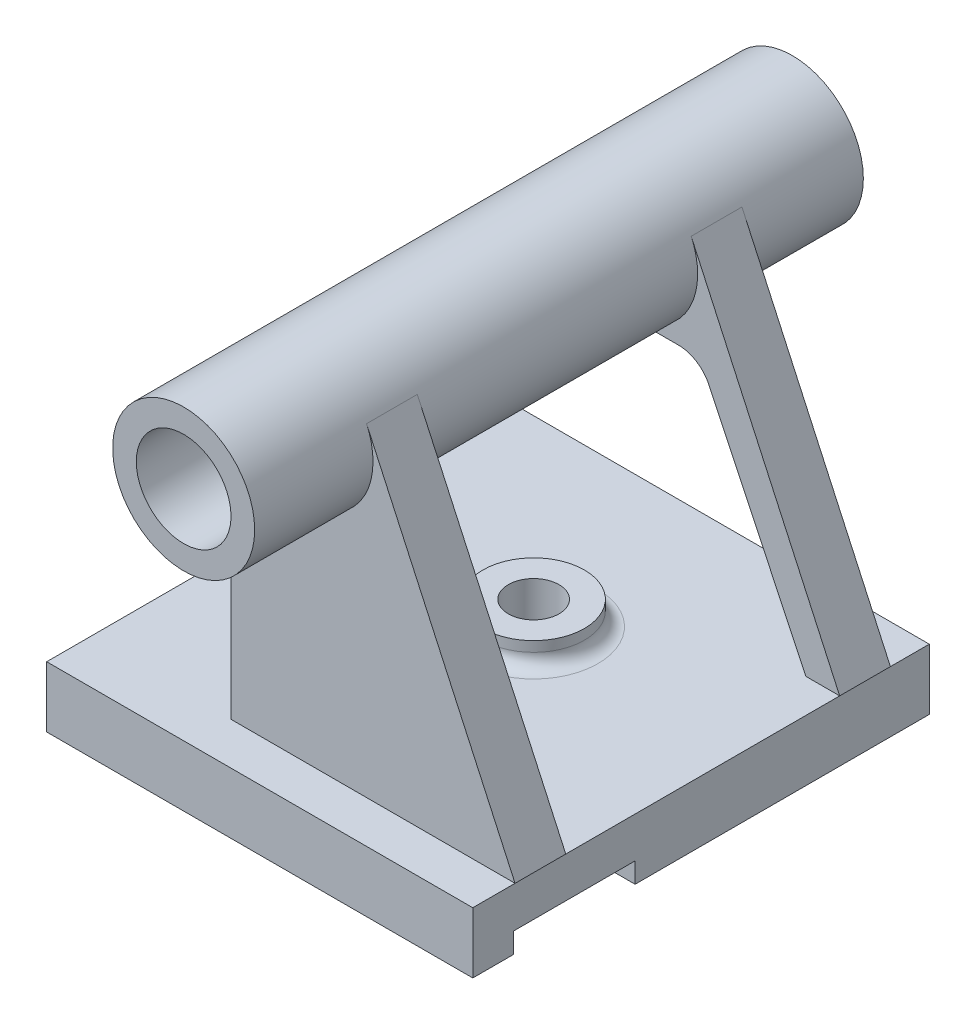
ISO-10303-21;
HEADER;
FILE_DESCRIPTION(('STEP AP214'),'2;1');
FILE_NAME('part.step','',(''),(''),'','','');
FILE_SCHEMA(('AUTOMOTIVE_DESIGN { 1 0 10303 214 1 1 1 1 }'));
ENDSEC;
DATA;
#1=APPLICATION_CONTEXT('core data for automotive mechanical design processes');
#2=APPLICATION_PROTOCOL_DEFINITION('international standard','automotive_design',2000,#1);
#3=PRODUCT_CONTEXT('',#1,'mechanical');
#4=PRODUCT('Part','Part','',(#3));
#5=PRODUCT_RELATED_PRODUCT_CATEGORY('part','',(#4));
#6=PRODUCT_DEFINITION_FORMATION('','',#4);
#7=PRODUCT_DEFINITION_CONTEXT('part definition',#1,'design');
#8=PRODUCT_DEFINITION('design','',#6,#7);
#9=PRODUCT_DEFINITION_SHAPE('','',#8);
#10=(LENGTH_UNIT() NAMED_UNIT(*) SI_UNIT(.MILLI.,.METRE.));
#11=(NAMED_UNIT(*) PLANE_ANGLE_UNIT() SI_UNIT($,.RADIAN.));
#12=(NAMED_UNIT(*) SI_UNIT($,.STERADIAN.) SOLID_ANGLE_UNIT());
#13=UNCERTAINTY_MEASURE_WITH_UNIT(LENGTH_MEASURE(1.E-05),#10,'distance_accuracy_value','');
#14=(GEOMETRIC_REPRESENTATION_CONTEXT(3) GLOBAL_UNCERTAINTY_ASSIGNED_CONTEXT((#13)) GLOBAL_UNIT_ASSIGNED_CONTEXT((#10,
#11,#12)) REPRESENTATION_CONTEXT('',''));
#15=CARTESIAN_POINT('',(0.,0.,0.));
#16=DIRECTION('',(0.,0.,1.));
#17=DIRECTION('',(1.,0.,0.));
#18=AXIS2_PLACEMENT_3D('',#15,#16,#17);
#19=CARTESIAN_POINT('',(0.,0.,180.));
#20=DIRECTION('',(0.,0.,-1.));
#21=DIRECTION('',(-1.,0.,0.));
#22=AXIS2_PLACEMENT_3D('',#19,#20,#21);
#23=CYLINDRICAL_SURFACE('',#22,21.);
#24=CARTESIAN_POINT('',(0.,0.,130.));
#25=DIRECTION('',(0.,0.,-1.));
#26=DIRECTION('',(1.,0.,0.));
#27=AXIS2_PLACEMENT_3D('',#24,#25,#26);
#28=CIRCLE('',#27,21.);
#29=CARTESIAN_POINT('',(19.0885231956979,8.75375817619506,130.));
#30=VERTEX_POINT('',#29);
#31=CARTESIAN_POINT('',(-21.,0.,130.));
#32=VERTEX_POINT('',#31);
#33=EDGE_CURVE('E262',#30,#32,#28,.T.);
#34=ORIENTED_EDGE('',*,*,#33,.T.);
#35=DIRECTION('',(0.,0.,1.));
#36=VECTOR('',#35,1.);
#37=CARTESIAN_POINT('',(-21.,0.,130.));
#38=LINE('',#37,#36);
#39=CARTESIAN_POINT('',(-21.,0.,145.));
#40=VERTEX_POINT('',#39);
#41=EDGE_CURVE('E275',#32,#40,#38,.T.);
#42=ORIENTED_EDGE('',*,*,#41,.T.);
#43=CARTESIAN_POINT('',(0.,0.,145.));
#44=DIRECTION('',(0.,0.,-1.));
#45=DIRECTION('',(1.,0.,0.));
#46=AXIS2_PLACEMENT_3D('',#43,#44,#45);
#47=CIRCLE('',#46,21.);
#48=CARTESIAN_POINT('',(19.0885231956979,8.75375817619506,145.));
#49=VERTEX_POINT('',#48);
#50=EDGE_CURVE('E261',#49,#40,#47,.T.);
#51=ORIENTED_EDGE('',*,*,#50,.F.);
#52=DIRECTION('',(0.,0.,1.));
#53=VECTOR('',#52,1.);
#54=CARTESIAN_POINT('',(19.0885231956979,8.75375817619506,130.));
#55=LINE('',#54,#53);
#56=EDGE_CURVE('E285',#30,#49,#55,.T.);
#57=ORIENTED_EDGE('',*,*,#56,.F.);
#58=EDGE_LOOP('',(#34,#42,#51,#57));
#59=FACE_BOUND('',#58,.T.);
#60=CARTESIAN_POINT('',(0.,0.,180.));
#61=DIRECTION('',(0.,0.,1.));
#62=DIRECTION('',(1.,0.,0.));
#63=AXIS2_PLACEMENT_3D('',#60,#61,#62);
#64=CIRCLE('',#63,21.);
#65=CARTESIAN_POINT('',(21.,0.,180.));
#66=VERTEX_POINT('',#65);
#67=EDGE_CURVE('E11',#66,#66,#64,.T.);
#68=ORIENTED_EDGE('',*,*,#67,.F.);
#69=EDGE_LOOP('',(#68));
#70=FACE_BOUND('',#69,.T.);
#71=CARTESIAN_POINT('',(0.,0.,0.));
#72=DIRECTION('',(0.,0.,1.));
#73=DIRECTION('',(1.,0.,0.));
#74=AXIS2_PLACEMENT_3D('',#71,#72,#73);
#75=CIRCLE('',#74,21.);
#76=CARTESIAN_POINT('',(21.,0.,0.));
#77=VERTEX_POINT('',#76);
#78=EDGE_CURVE('E41',#77,#77,#75,.T.);
#79=ORIENTED_EDGE('',*,*,#78,.T.);
#80=EDGE_LOOP('',(#79));
#81=FACE_BOUND('',#80,.T.);
#82=CARTESIAN_POINT('',(0.,0.,34.));
#83=DIRECTION('',(0.,0.,1.));
#84=DIRECTION('',(1.,0.,0.));
#85=AXIS2_PLACEMENT_3D('',#82,#83,#84);
#86=CIRCLE('',#85,21.);
#87=CARTESIAN_POINT('',(-2.23324351081822E-13,-21.,34.));
#88=VERTEX_POINT('',#87);
#89=CARTESIAN_POINT('',(19.0885231956979,8.75375817619506,34.));
#90=VERTEX_POINT('',#89);
#91=EDGE_CURVE('E166',#88,#90,#86,.T.);
#92=ORIENTED_EDGE('',*,*,#91,.F.);
#93=DIRECTION('',(0.,0.,1.));
#94=VECTOR('',#93,1.);
#95=CARTESIAN_POINT('',(-2.23324351081822E-13,-21.,34.));
#96=LINE('',#95,#94);
#97=CARTESIAN_POINT('',(-2.23324351081822E-13,-21.,49.));
#98=VERTEX_POINT('',#97);
#99=EDGE_CURVE('E599',#88,#98,#96,.T.);
#100=ORIENTED_EDGE('',*,*,#99,.T.);
#101=CARTESIAN_POINT('',(0.,0.,49.));
#102=DIRECTION('',(0.,0.,1.));
#103=DIRECTION('',(1.,0.,0.));
#104=AXIS2_PLACEMENT_3D('',#101,#102,#103);
#105=CIRCLE('',#104,21.);
#106=CARTESIAN_POINT('',(19.0885231956979,8.75375817619506,49.));
#107=VERTEX_POINT('',#106);
#108=EDGE_CURVE('E179',#98,#107,#105,.T.);
#109=ORIENTED_EDGE('',*,*,#108,.T.);
#110=DIRECTION('',(0.,0.,1.));
#111=VECTOR('',#110,1.);
#112=CARTESIAN_POINT('',(19.0885231956979,8.75375817619506,34.));
#113=LINE('',#112,#111);
#114=EDGE_CURVE('E49',#90,#107,#113,.T.);
#115=ORIENTED_EDGE('',*,*,#114,.F.);
#116=EDGE_LOOP('',(#92,#100,#109,#115));
#117=FACE_BOUND('',#116,.T.);
#118=ADVANCED_FACE('F33',(#59,#70,#81,#117),#23,.T.);
#119=CARTESIAN_POINT('',(63.,-87.,22.5));
#120=DIRECTION('',(0.,-1.,0.));
#121=DIRECTION('',(0.,0.,-1.));
#122=AXIS2_PLACEMENT_3D('',#119,#120,#121);
#123=PLANE('',#122);
#124=CARTESIAN_POINT('',(0.,-87.,76.5));
#125=DIRECTION('',(0.,-1.,0.));
#126=DIRECTION('',(0.,0.,-1.));
#127=AXIS2_PLACEMENT_3D('',#124,#125,#126);
#128=CIRCLE('',#127,19.);
#129=CARTESIAN_POINT('',(0.,-87.,57.5));
#130=VERTEX_POINT('',#129);
#131=EDGE_CURVE('E258',#130,#130,#128,.T.);
#132=ORIENTED_EDGE('',*,*,#131,.T.);
#133=EDGE_LOOP('',(#132));
#134=FACE_BOUND('',#133,.T.);
#135=DIRECTION('',(-1.,0.,0.));
#136=VECTOR('',#135,1.);
#137=CARTESIAN_POINT('',(63.,-87.,34.));
#138=LINE('',#137,#136);
#139=CARTESIAN_POINT('',(63.,-87.,34.));
#140=VERTEX_POINT('',#139);
#141=CARTESIAN_POINT('',(53.,-87.,34.));
#142=VERTEX_POINT('',#141);
#143=EDGE_CURVE('E165',#140,#142,#138,.T.);
#144=ORIENTED_EDGE('',*,*,#143,.F.);
#145=DIRECTION('',(0.,0.,1.));
#146=VECTOR('',#145,1.);
#147=CARTESIAN_POINT('',(63.,-87.,22.5));
#148=LINE('',#147,#146);
#149=CARTESIAN_POINT('',(63.,-87.,22.5));
#150=VERTEX_POINT('',#149);
#151=EDGE_CURVE('E242',#150,#140,#148,.T.);
#152=ORIENTED_EDGE('',*,*,#151,.F.);
#153=DIRECTION('',(1.,0.,0.));
#154=VECTOR('',#153,1.);
#155=CARTESIAN_POINT('',(63.,-87.,22.5));
#156=LINE('',#155,#154);
#157=CARTESIAN_POINT('',(-63.,-87.,22.5));
#158=VERTEX_POINT('',#157);
#159=EDGE_CURVE('E216',#158,#150,#156,.T.);
#160=ORIENTED_EDGE('',*,*,#159,.F.);
#161=DIRECTION('',(0.,0.,1.));
#162=VECTOR('',#161,1.);
#163=CARTESIAN_POINT('',(-63.,-87.,22.5));
#164=LINE('',#163,#162);
#165=CARTESIAN_POINT('',(-63.,-87.,157.5));
#166=VERTEX_POINT('',#165);
#167=EDGE_CURVE('E245',#158,#166,#164,.T.);
#168=ORIENTED_EDGE('',*,*,#167,.T.);
#169=DIRECTION('',(1.,0.,0.));
#170=VECTOR('',#169,1.);
#171=CARTESIAN_POINT('',(63.,-87.,157.5));
#172=LINE('',#171,#170);
#173=CARTESIAN_POINT('',(63.,-87.,157.5));
#174=VERTEX_POINT('',#173);
#175=EDGE_CURVE('E226',#166,#174,#172,.T.);
#176=ORIENTED_EDGE('',*,*,#175,.T.);
#177=CARTESIAN_POINT('',(63.,-87.,145.));
#178=VERTEX_POINT('',#177);
#179=EDGE_CURVE('E241',#178,#174,#148,.T.);
#180=ORIENTED_EDGE('',*,*,#179,.F.);
#181=DIRECTION('',(1.,0.,0.));
#182=VECTOR('',#181,1.);
#183=CARTESIAN_POINT('',(-21.,-87.,145.));
#184=LINE('',#183,#182);
#185=CARTESIAN_POINT('',(-21.,-87.,145.));
#186=VERTEX_POINT('',#185);
#187=EDGE_CURVE('E281',#186,#178,#184,.T.);
#188=ORIENTED_EDGE('',*,*,#187,.F.);
#189=DIRECTION('',(0.,0.,1.));
#190=VECTOR('',#189,1.);
#191=CARTESIAN_POINT('',(-21.,-87.,130.));
#192=LINE('',#191,#190);
#193=CARTESIAN_POINT('',(-21.,-87.,130.));
#194=VERTEX_POINT('',#193);
#195=EDGE_CURVE('E291',#194,#186,#192,.T.);
#196=ORIENTED_EDGE('',*,*,#195,.F.);
#197=DIRECTION('',(1.,0.,0.));
#198=VECTOR('',#197,1.);
#199=CARTESIAN_POINT('',(-21.,-87.,130.));
#200=LINE('',#199,#198);
#201=CARTESIAN_POINT('',(63.,-87.,130.));
#202=VERTEX_POINT('',#201);
#203=EDGE_CURVE('E269',#194,#202,#200,.T.);
#204=ORIENTED_EDGE('',*,*,#203,.T.);
#205=CARTESIAN_POINT('',(63.,-87.,49.));
#206=VERTEX_POINT('',#205);
#207=EDGE_CURVE('E246',#206,#202,#148,.T.);
#208=ORIENTED_EDGE('',*,*,#207,.F.);
#209=DIRECTION('',(-1.,0.,0.));
#210=VECTOR('',#209,1.);
#211=CARTESIAN_POINT('',(63.,-87.,49.));
#212=LINE('',#211,#210);
#213=CARTESIAN_POINT('',(53.,-87.,49.));
#214=VERTEX_POINT('',#213);
#215=EDGE_CURVE('E56',#206,#214,#212,.T.);
#216=ORIENTED_EDGE('',*,*,#215,.T.);
#217=DIRECTION('',(0.,0.,1.));
#218=VECTOR('',#217,1.);
#219=CARTESIAN_POINT('',(53.,-87.,34.));
#220=LINE('',#219,#218);
#221=EDGE_CURVE('E185',#142,#214,#220,.T.);
#222=ORIENTED_EDGE('',*,*,#221,.F.);
#223=EDGE_LOOP('',(#144,#152,#160,#168,#176,#180,#188,#196,#204,#208,#216,#222));
#224=FACE_BOUND('',#223,.T.);
#225=ADVANCED_FACE('F324',(#134,#224),#123,.F.);
#226=CARTESIAN_POINT('',(0.,0.,180.));
#227=DIRECTION('',(0.,0.,1.));
#228=DIRECTION('',(1.,0.,0.));
#229=AXIS2_PLACEMENT_3D('',#226,#227,#228);
#230=PLANE('',#229);
#231=ORIENTED_EDGE('',*,*,#67,.T.);
#232=EDGE_LOOP('',(#231));
#233=FACE_BOUND('',#232,.T.);
#234=CARTESIAN_POINT('',(0.,0.,180.));
#235=DIRECTION('',(0.,0.,1.));
#236=DIRECTION('',(1.,0.,0.));
#237=AXIS2_PLACEMENT_3D('',#234,#235,#236);
#238=CIRCLE('',#237,14.);
#239=CARTESIAN_POINT('',(-14.,0.,180.));
#240=VERTEX_POINT('',#239);
#241=EDGE_CURVE('E296',#240,#240,#238,.T.);
#242=ORIENTED_EDGE('',*,*,#241,.F.);
#243=EDGE_LOOP('',(#242));
#244=FACE_BOUND('',#243,.T.);
#245=ADVANCED_FACE('F308',(#233,#244),#230,.T.);
#246=CARTESIAN_POINT('',(0.,0.,0.));
#247=DIRECTION('',(0.,0.,1.));
#248=DIRECTION('',(1.,0.,0.));
#249=AXIS2_PLACEMENT_3D('',#246,#247,#248);
#250=PLANE('',#249);
#251=ORIENTED_EDGE('',*,*,#78,.F.);
#252=EDGE_LOOP('',(#251));
#253=FACE_BOUND('',#252,.T.);
#254=CARTESIAN_POINT('',(0.,0.,0.));
#255=DIRECTION('',(0.,0.,1.));
#256=DIRECTION('',(1.,0.,0.));
#257=AXIS2_PLACEMENT_3D('',#254,#255,#256);
#258=CIRCLE('',#257,14.);
#259=CARTESIAN_POINT('',(-14.,0.,0.));
#260=VERTEX_POINT('',#259);
#261=EDGE_CURVE('E288',#260,#260,#258,.T.);
#262=ORIENTED_EDGE('',*,*,#261,.T.);
#263=EDGE_LOOP('',(#262));
#264=FACE_BOUND('',#263,.T.);
#265=ADVANCED_FACE('F304',(#253,#264),#250,.F.);
#266=CARTESIAN_POINT('',(0.,0.,180.));
#267=DIRECTION('',(0.,0.,-1.));
#268=DIRECTION('',(-1.,0.,0.));
#269=AXIS2_PLACEMENT_3D('',#266,#267,#268);
#270=CYLINDRICAL_SURFACE('',#269,14.);
#271=CARTESIAN_POINT('',(-14.,0.,180.));
#272=CARTESIAN_POINT('',(-14.,0.,178.125));
#273=CARTESIAN_POINT('',(-14.,0.,176.25));
#274=CARTESIAN_POINT('',(-14.,0.,172.5));
#275=CARTESIAN_POINT('',(-14.,0.,170.625));
#276=CARTESIAN_POINT('',(-14.,0.,166.875));
#277=CARTESIAN_POINT('',(-14.,0.,165.));
#278=CARTESIAN_POINT('',(-14.,0.,161.25));
#279=CARTESIAN_POINT('',(-14.,0.,159.375));
#280=CARTESIAN_POINT('',(-14.,0.,155.625));
#281=CARTESIAN_POINT('',(-14.,0.,153.75));
#282=CARTESIAN_POINT('',(-14.,0.,150.));
#283=CARTESIAN_POINT('',(-14.,0.,148.125));
#284=CARTESIAN_POINT('',(-14.,0.,144.375));
#285=CARTESIAN_POINT('',(-14.,0.,142.5));
#286=CARTESIAN_POINT('',(-14.,0.,138.75));
#287=CARTESIAN_POINT('',(-14.,0.,136.875));
#288=CARTESIAN_POINT('',(-14.,0.,133.125));
#289=CARTESIAN_POINT('',(-14.,0.,131.25));
#290=CARTESIAN_POINT('',(-14.,0.,127.5));
#291=CARTESIAN_POINT('',(-14.,0.,125.625));
#292=CARTESIAN_POINT('',(-14.,0.,121.875));
#293=CARTESIAN_POINT('',(-14.,0.,120.));
#294=CARTESIAN_POINT('',(-14.,0.,116.25));
#295=CARTESIAN_POINT('',(-14.,0.,114.375));
#296=CARTESIAN_POINT('',(-14.,0.,110.625));
#297=CARTESIAN_POINT('',(-14.,0.,108.75));
#298=CARTESIAN_POINT('',(-14.,0.,105.));
#299=CARTESIAN_POINT('',(-14.,0.,103.125));
#300=CARTESIAN_POINT('',(-14.,0.,99.375));
#301=CARTESIAN_POINT('',(-14.,0.,97.5));
#302=CARTESIAN_POINT('',(-14.,0.,93.75));
#303=CARTESIAN_POINT('',(-14.,0.,91.875));
#304=CARTESIAN_POINT('',(-14.,0.,88.125));
#305=CARTESIAN_POINT('',(-14.,0.,86.25));
#306=CARTESIAN_POINT('',(-14.,0.,82.5));
#307=CARTESIAN_POINT('',(-14.,0.,80.625));
#308=CARTESIAN_POINT('',(-14.,0.,76.875));
#309=CARTESIAN_POINT('',(-14.,0.,75.));
#310=CARTESIAN_POINT('',(-14.,0.,71.25));
#311=CARTESIAN_POINT('',(-14.,0.,69.375));
#312=CARTESIAN_POINT('',(-14.,0.,65.625));
#313=CARTESIAN_POINT('',(-14.,0.,63.75));
#314=CARTESIAN_POINT('',(-14.,0.,60.));
#315=CARTESIAN_POINT('',(-14.,0.,58.125));
#316=CARTESIAN_POINT('',(-14.,0.,54.375));
#317=CARTESIAN_POINT('',(-14.,0.,52.5));
#318=CARTESIAN_POINT('',(-14.,0.,48.75));
#319=CARTESIAN_POINT('',(-14.,0.,46.875));
#320=CARTESIAN_POINT('',(-14.,0.,43.125));
#321=CARTESIAN_POINT('',(-14.,0.,41.25));
#322=CARTESIAN_POINT('',(-14.,0.,37.5));
#323=CARTESIAN_POINT('',(-14.,0.,35.625));
#324=CARTESIAN_POINT('',(-14.,0.,31.875));
#325=CARTESIAN_POINT('',(-14.,0.,30.));
#326=CARTESIAN_POINT('',(-14.,0.,26.25));
#327=CARTESIAN_POINT('',(-14.,0.,24.375));
#328=CARTESIAN_POINT('',(-14.,0.,20.625));
#329=CARTESIAN_POINT('',(-14.,0.,18.75));
#330=CARTESIAN_POINT('',(-14.,0.,15.));
#331=CARTESIAN_POINT('',(-14.,0.,13.125));
#332=CARTESIAN_POINT('',(-14.,0.,9.37499999999998));
#333=CARTESIAN_POINT('',(-14.,0.,7.49999999999997));
#334=CARTESIAN_POINT('',(-14.,0.,3.74999999999997));
#335=CARTESIAN_POINT('',(-14.,0.,1.87499999999997));
#336=CARTESIAN_POINT('',(-14.,0.,0.));
#337=B_SPLINE_CURVE_WITH_KNOTS('',3,(#271,#272,#273,#274,#275,#276,#277,#278,#279,#280,#281,
#282,#283,#284,#285,#286,#287,#288,#289,#290,#291,#292,#293,#294,#295,#296,#297,#298,#299,#300,
#301,#302,#303,#304,#305,#306,#307,#308,#309,#310,#311,#312,#313,#314,#315,#316,#317,#318,#319,
#320,#321,#322,#323,#324,#325,#326,#327,#328,#329,#330,#331,#332,#333,#334,#335,#336),
.UNSPECIFIED.,.F.,.F.,(4,2,2,2,2,2,2,2,2,2,2,2,2,2,2,2,2,2,2,2,2,2,2,2,2,2,2,2,2,2,2,2,4),(0.,
5.62500000000002,11.25,16.875,22.5,28.125,33.75,39.375,45.,50.625,56.25,61.875,67.5,73.125,
78.75,84.375,90.,95.625,101.25,106.875,112.5,118.125,123.75,129.375,135.,140.625,146.25,151.875,
157.5,163.125,168.75,174.375,180.),.UNSPECIFIED.);
#338=EDGE_CURVE('BSEAM307',#240,#260,#337,.T.);
#339=ORIENTED_EDGE('',*,*,#241,.T.);
#340=ORIENTED_EDGE('',*,*,#261,.F.);
#341=ORIENTED_EDGE('',*,*,#338,.T.);
#342=ORIENTED_EDGE('',*,*,#338,.F.);
#343=EDGE_LOOP('',(#339,#341,#340,#342));
#344=FACE_BOUND('',#343,.T.);
#345=ADVANCED_FACE('F307',(#344),#270,.F.);
#346=CARTESIAN_POINT('',(19.0885231956979,8.75375817619506,130.));
#347=DIRECTION('',(0.908977295033235,0.41684562743786,0.));
#348=DIRECTION('',(-0.41684562743786,0.908977295033235,0.));
#349=AXIS2_PLACEMENT_3D('',#346,#347,#348);
#350=PLANE('',#349);
#351=DIRECTION('',(-0.41684562743786,0.908977295033235,0.));
#352=VECTOR('',#351,1.);
#353=CARTESIAN_POINT('',(19.0885231956979,8.75375817619506,145.));
#354=LINE('',#353,#352);
#355=EDGE_CURVE('E266',#178,#49,#354,.T.);
#356=ORIENTED_EDGE('',*,*,#355,.F.);
#357=DIRECTION('',(0.,0.,1.));
#358=VECTOR('',#357,1.);
#359=CARTESIAN_POINT('',(63.,-87.,130.));
#360=LINE('',#359,#358);
#361=EDGE_CURVE('E289',#202,#178,#360,.T.);
#362=ORIENTED_EDGE('',*,*,#361,.F.);
#363=DIRECTION('',(-0.41684562743786,0.908977295033235,0.));
#364=VECTOR('',#363,1.);
#365=CARTESIAN_POINT('',(19.0885231956979,8.75375817619506,130.));
#366=LINE('',#365,#364);
#367=EDGE_CURVE('E272',#202,#30,#366,.T.);
#368=ORIENTED_EDGE('',*,*,#367,.T.);
#369=ORIENTED_EDGE('',*,*,#56,.T.);
#370=EDGE_LOOP('',(#356,#362,#368,#369));
#371=FACE_BOUND('',#370,.T.);
#372=ADVANCED_FACE('F312',(#371),#350,.T.);
#373=CARTESIAN_POINT('',(-21.,0.,130.));
#374=DIRECTION('',(-1.,0.,0.));
#375=DIRECTION('',(0.,-1.,0.));
#376=AXIS2_PLACEMENT_3D('',#373,#374,#375);
#377=PLANE('',#376);
#378=DIRECTION('',(0.,-1.,0.));
#379=VECTOR('',#378,1.);
#380=CARTESIAN_POINT('',(-21.,0.,145.));
#381=LINE('',#380,#379);
#382=EDGE_CURVE('E278',#40,#186,#381,.T.);
#383=ORIENTED_EDGE('',*,*,#382,.F.);
#384=ORIENTED_EDGE('',*,*,#41,.F.);
#385=DIRECTION('',(0.,-1.,0.));
#386=VECTOR('',#385,1.);
#387=CARTESIAN_POINT('',(-21.,0.,130.));
#388=LINE('',#387,#386);
#389=EDGE_CURVE('E265',#32,#194,#388,.T.);
#390=ORIENTED_EDGE('',*,*,#389,.T.);
#391=ORIENTED_EDGE('',*,*,#195,.T.);
#392=EDGE_LOOP('',(#383,#384,#390,#391));
#393=FACE_BOUND('',#392,.T.);
#394=ADVANCED_FACE('F318',(#393),#377,.T.);
#395=CARTESIAN_POINT('',(0.,0.,130.));
#396=DIRECTION('',(0.,0.,1.));
#397=DIRECTION('',(1.,0.,0.));
#398=AXIS2_PLACEMENT_3D('',#395,#396,#397);
#399=PLANE('',#398);
#400=ORIENTED_EDGE('',*,*,#33,.F.);
#401=ORIENTED_EDGE('',*,*,#367,.F.);
#402=ORIENTED_EDGE('',*,*,#203,.F.);
#403=ORIENTED_EDGE('',*,*,#389,.F.);
#404=EDGE_LOOP('',(#400,#401,#402,#403));
#405=FACE_BOUND('',#404,.T.);
#406=ADVANCED_FACE('F367',(#405),#399,.F.);
#407=CARTESIAN_POINT('',(0.,0.,145.));
#408=DIRECTION('',(0.,0.,1.));
#409=DIRECTION('',(1.,0.,0.));
#410=AXIS2_PLACEMENT_3D('',#407,#408,#409);
#411=PLANE('',#410);
#412=ORIENTED_EDGE('',*,*,#50,.T.);
#413=ORIENTED_EDGE('',*,*,#382,.T.);
#414=ORIENTED_EDGE('',*,*,#187,.T.);
#415=ORIENTED_EDGE('',*,*,#355,.T.);
#416=EDGE_LOOP('',(#412,#413,#414,#415));
#417=FACE_BOUND('',#416,.T.);
#418=ADVANCED_FACE('F376',(#417),#411,.T.);
#419=CARTESIAN_POINT('',(63.,-105.,22.5));
#420=DIRECTION('',(0.,1.,0.));
#421=DIRECTION('',(0.,0.,1.));
#422=AXIS2_PLACEMENT_3D('',#419,#420,#421);
#423=PLANE('',#422);
#424=DIRECTION('',(0.,0.,1.));
#425=VECTOR('',#424,1.);
#426=CARTESIAN_POINT('',(-63.,-105.,22.5));
#427=LINE('',#426,#425);
#428=CARTESIAN_POINT('',(-63.,-105.,145.5));
#429=VERTEX_POINT('',#428);
#430=CARTESIAN_POINT('',(-63.,-105.,157.5));
#431=VERTEX_POINT('',#430);
#432=EDGE_CURVE('E223',#429,#431,#427,.T.);
#433=ORIENTED_EDGE('',*,*,#432,.F.);
#434=DIRECTION('',(1.,0.,0.));
#435=VECTOR('',#434,1.);
#436=CARTESIAN_POINT('',(63.,-105.,145.5));
#437=LINE('',#436,#435);
#438=CARTESIAN_POINT('',(63.,-105.,145.5));
#439=VERTEX_POINT('',#438);
#440=EDGE_CURVE('E252',#429,#439,#437,.T.);
#441=ORIENTED_EDGE('',*,*,#440,.T.);
#442=DIRECTION('',(0.,0.,1.));
#443=VECTOR('',#442,1.);
#444=CARTESIAN_POINT('',(63.,-105.,22.5));
#445=LINE('',#444,#443);
#446=CARTESIAN_POINT('',(63.,-105.,157.5));
#447=VERTEX_POINT('',#446);
#448=EDGE_CURVE('E237',#439,#447,#445,.T.);
#449=ORIENTED_EDGE('',*,*,#448,.T.);
#450=DIRECTION('',(-1.,0.,0.));
#451=VECTOR('',#450,1.);
#452=CARTESIAN_POINT('',(63.,-105.,157.5));
#453=LINE('',#452,#451);
#454=EDGE_CURVE('E217',#447,#431,#453,.T.);
#455=ORIENTED_EDGE('',*,*,#454,.T.);
#456=EDGE_LOOP('',(#433,#441,#449,#455));
#457=FACE_BOUND('',#456,.T.);
#458=ADVANCED_FACE('F386',(#457),#423,.F.);
#459=CARTESIAN_POINT('',(-63.,-87.,22.5));
#460=DIRECTION('',(1.,0.,0.));
#461=DIRECTION('',(0.,0.,-1.));
#462=AXIS2_PLACEMENT_3D('',#459,#460,#461);
#463=PLANE('',#462);
#464=DIRECTION('',(0.,0.,1.));
#465=VECTOR('',#464,1.);
#466=CARTESIAN_POINT('',(-63.,-99.,22.5));
#467=LINE('',#466,#465);
#468=CARTESIAN_POINT('',(-63.,-99.,109.5));
#469=VERTEX_POINT('',#468);
#470=CARTESIAN_POINT('',(-63.,-99.,145.5));
#471=VERTEX_POINT('',#470);
#472=EDGE_CURVE('E209',#469,#471,#467,.T.);
#473=ORIENTED_EDGE('',*,*,#472,.T.);
#474=DIRECTION('',(0.,-1.,0.));
#475=VECTOR('',#474,1.);
#476=CARTESIAN_POINT('',(-63.,-87.,145.5));
#477=LINE('',#476,#475);
#478=EDGE_CURVE('E206',#471,#429,#477,.T.);
#479=ORIENTED_EDGE('',*,*,#478,.T.);
#480=ORIENTED_EDGE('',*,*,#432,.T.);
#481=DIRECTION('',(0.,1.,0.));
#482=VECTOR('',#481,1.);
#483=CARTESIAN_POINT('',(-63.,-87.,157.5));
#484=LINE('',#483,#482);
#485=EDGE_CURVE('E212',#431,#166,#484,.T.);
#486=ORIENTED_EDGE('',*,*,#485,.T.);
#487=ORIENTED_EDGE('',*,*,#167,.F.);
#488=DIRECTION('',(0.,1.,0.));
#489=VECTOR('',#488,1.);
#490=CARTESIAN_POINT('',(-63.,-87.,22.5));
#491=LINE('',#490,#489);
#492=CARTESIAN_POINT('',(-63.,-105.,22.5));
#493=VERTEX_POINT('',#492);
#494=EDGE_CURVE('E213',#493,#158,#491,.T.);
#495=ORIENTED_EDGE('',*,*,#494,.F.);
#496=CARTESIAN_POINT('',(-63.,-105.,109.5));
#497=VERTEX_POINT('',#496);
#498=EDGE_CURVE('E234',#493,#497,#427,.T.);
#499=ORIENTED_EDGE('',*,*,#498,.T.);
#500=DIRECTION('',(0.,1.,0.));
#501=VECTOR('',#500,1.);
#502=CARTESIAN_POINT('',(-63.,-87.,109.5));
#503=LINE('',#502,#501);
#504=EDGE_CURVE('E202',#497,#469,#503,.T.);
#505=ORIENTED_EDGE('',*,*,#504,.T.);
#506=EDGE_LOOP('',(#473,#479,#480,#486,#487,#495,#499,#505));
#507=FACE_BOUND('',#506,.T.);
#508=ADVANCED_FACE('F396',(#507),#463,.F.);
#509=CARTESIAN_POINT('',(63.,-87.,22.5));
#510=DIRECTION('',(-1.,0.,0.));
#511=DIRECTION('',(0.,0.,1.));
#512=AXIS2_PLACEMENT_3D('',#509,#510,#511);
#513=PLANE('',#512);
#514=ORIENTED_EDGE('',*,*,#448,.F.);
#515=DIRECTION('',(0.,-1.,0.));
#516=VECTOR('',#515,1.);
#517=CARTESIAN_POINT('',(63.,-105.,145.5));
#518=LINE('',#517,#516);
#519=CARTESIAN_POINT('',(63.,-99.,145.5));
#520=VERTEX_POINT('',#519);
#521=EDGE_CURVE('E191',#520,#439,#518,.T.);
#522=ORIENTED_EDGE('',*,*,#521,.F.);
#523=DIRECTION('',(0.,0.,1.));
#524=VECTOR('',#523,1.);
#525=CARTESIAN_POINT('',(63.,-99.,145.5));
#526=LINE('',#525,#524);
#527=CARTESIAN_POINT('',(63.,-99.,109.5));
#528=VERTEX_POINT('',#527);
#529=EDGE_CURVE('E196',#528,#520,#526,.T.);
#530=ORIENTED_EDGE('',*,*,#529,.F.);
#531=DIRECTION('',(0.,1.,0.));
#532=VECTOR('',#531,1.);
#533=CARTESIAN_POINT('',(63.,-105.,109.5));
#534=LINE('',#533,#532);
#535=CARTESIAN_POINT('',(63.,-105.,109.5));
#536=VERTEX_POINT('',#535);
#537=EDGE_CURVE('E193',#536,#528,#534,.T.);
#538=ORIENTED_EDGE('',*,*,#537,.F.);
#539=CARTESIAN_POINT('',(63.,-105.,22.5));
#540=VERTEX_POINT('',#539);
#541=EDGE_CURVE('E238',#540,#536,#445,.T.);
#542=ORIENTED_EDGE('',*,*,#541,.F.);
#543=DIRECTION('',(0.,-1.,0.));
#544=VECTOR('',#543,1.);
#545=CARTESIAN_POINT('',(63.,-87.,22.5));
#546=LINE('',#545,#544);
#547=EDGE_CURVE('E219',#150,#540,#546,.T.);
#548=ORIENTED_EDGE('',*,*,#547,.F.);
#549=ORIENTED_EDGE('',*,*,#151,.T.);
#550=DIRECTION('',(0.,0.,1.));
#551=VECTOR('',#550,1.);
#552=CARTESIAN_POINT('',(63.,-87.,34.));
#553=LINE('',#552,#551);
#554=EDGE_CURVE('E162',#140,#206,#553,.T.);
#555=ORIENTED_EDGE('',*,*,#554,.T.);
#556=ORIENTED_EDGE('',*,*,#207,.T.);
#557=ORIENTED_EDGE('',*,*,#361,.T.);
#558=ORIENTED_EDGE('',*,*,#179,.T.);
#559=DIRECTION('',(0.,-1.,0.));
#560=VECTOR('',#559,1.);
#561=CARTESIAN_POINT('',(63.,-87.,157.5));
#562=LINE('',#561,#560);
#563=EDGE_CURVE('E229',#174,#447,#562,.T.);
#564=ORIENTED_EDGE('',*,*,#563,.T.);
#565=EDGE_LOOP('',(#514,#522,#530,#538,#542,#548,#549,#555,#556,#557,#558,#564));
#566=FACE_BOUND('',#565,.T.);
#567=ADVANCED_FACE('F407',(#566),#513,.F.);
#568=CARTESIAN_POINT('',(0.,-105.,76.5));
#569=DIRECTION('',(0.,1.,0.));
#570=DIRECTION('',(0.,0.,1.));
#571=AXIS2_PLACEMENT_3D('',#568,#569,#570);
#572=CIRCLE('',#571,7.50000000000001);
#573=CARTESIAN_POINT('',(0.,-105.,84.));
#574=VERTEX_POINT('',#573);
#575=EDGE_CURVE('E36',#574,#574,#572,.T.);
#576=ORIENTED_EDGE('',*,*,#575,.T.);
#577=EDGE_LOOP('',(#576));
#578=FACE_BOUND('',#577,.T.);
#579=ORIENTED_EDGE('',*,*,#541,.T.);
#580=DIRECTION('',(-1.,0.,0.));
#581=VECTOR('',#580,1.);
#582=CARTESIAN_POINT('',(63.,-105.,109.5));
#583=LINE('',#582,#581);
#584=EDGE_CURVE('E249',#536,#497,#583,.T.);
#585=ORIENTED_EDGE('',*,*,#584,.T.);
#586=ORIENTED_EDGE('',*,*,#498,.F.);
#587=DIRECTION('',(-1.,0.,0.));
#588=VECTOR('',#587,1.);
#589=CARTESIAN_POINT('',(63.,-105.,22.5));
#590=LINE('',#589,#588);
#591=EDGE_CURVE('E221',#540,#493,#590,.T.);
#592=ORIENTED_EDGE('',*,*,#591,.F.);
#593=EDGE_LOOP('',(#579,#585,#586,#592));
#594=FACE_BOUND('',#593,.T.);
#595=ADVANCED_FACE('F399',(#578,#594),#423,.F.);
#596=CARTESIAN_POINT('',(0.,0.,22.5));
#597=DIRECTION('',(0.,0.,-1.));
#598=DIRECTION('',(-1.,0.,0.));
#599=AXIS2_PLACEMENT_3D('',#596,#597,#598);
#600=PLANE('',#599);
#601=ORIENTED_EDGE('',*,*,#494,.T.);
#602=ORIENTED_EDGE('',*,*,#159,.T.);
#603=ORIENTED_EDGE('',*,*,#547,.T.);
#604=ORIENTED_EDGE('',*,*,#591,.T.);
#605=EDGE_LOOP('',(#601,#602,#603,#604));
#606=FACE_BOUND('',#605,.T.);
#607=ADVANCED_FACE('F415',(#606),#600,.T.);
#608=CARTESIAN_POINT('',(0.,0.,157.5));
#609=DIRECTION('',(0.,0.,-1.));
#610=DIRECTION('',(-1.,0.,0.));
#611=AXIS2_PLACEMENT_3D('',#608,#609,#610);
#612=PLANE('',#611);
#613=ORIENTED_EDGE('',*,*,#485,.F.);
#614=ORIENTED_EDGE('',*,*,#454,.F.);
#615=ORIENTED_EDGE('',*,*,#563,.F.);
#616=ORIENTED_EDGE('',*,*,#175,.F.);
#617=EDGE_LOOP('',(#613,#614,#615,#616));
#618=FACE_BOUND('',#617,.T.);
#619=ADVANCED_FACE('F420',(#618),#612,.F.);
#620=CARTESIAN_POINT('',(-72.,-99.,145.5));
#621=DIRECTION('',(0.,1.,0.));
#622=DIRECTION('',(0.,0.,1.));
#623=AXIS2_PLACEMENT_3D('',#620,#621,#622);
#624=PLANE('',#623);
#625=DIRECTION('',(1.,0.,0.));
#626=VECTOR('',#625,1.);
#627=CARTESIAN_POINT('',(-72.,-99.,109.5));
#628=LINE('',#627,#626);
#629=EDGE_CURVE('E199',#469,#528,#628,.T.);
#630=ORIENTED_EDGE('',*,*,#629,.T.);
#631=ORIENTED_EDGE('',*,*,#529,.T.);
#632=DIRECTION('',(1.,0.,0.));
#633=VECTOR('',#632,1.);
#634=CARTESIAN_POINT('',(-72.,-99.,145.5));
#635=LINE('',#634,#633);
#636=EDGE_CURVE('E200',#471,#520,#635,.T.);
#637=ORIENTED_EDGE('',*,*,#636,.F.);
#638=ORIENTED_EDGE('',*,*,#472,.F.);
#639=EDGE_LOOP('',(#630,#631,#637,#638));
#640=FACE_BOUND('',#639,.T.);
#641=ADVANCED_FACE('F432',(#640),#624,.F.);
#642=CARTESIAN_POINT('',(-72.,-105.,145.5));
#643=DIRECTION('',(0.,0.,1.));
#644=DIRECTION('',(1.,0.,0.));
#645=AXIS2_PLACEMENT_3D('',#642,#643,#644);
#646=PLANE('',#645);
#647=ORIENTED_EDGE('',*,*,#636,.T.);
#648=ORIENTED_EDGE('',*,*,#521,.T.);
#649=ORIENTED_EDGE('',*,*,#440,.F.);
#650=ORIENTED_EDGE('',*,*,#478,.F.);
#651=EDGE_LOOP('',(#647,#648,#649,#650));
#652=FACE_BOUND('',#651,.T.);
#653=ADVANCED_FACE('F442',(#652),#646,.F.);
#654=CARTESIAN_POINT('',(-72.,-105.,109.5));
#655=DIRECTION('',(0.,0.,-1.));
#656=DIRECTION('',(-1.,0.,0.));
#657=AXIS2_PLACEMENT_3D('',#654,#655,#656);
#658=PLANE('',#657);
#659=ORIENTED_EDGE('',*,*,#584,.F.);
#660=ORIENTED_EDGE('',*,*,#537,.T.);
#661=ORIENTED_EDGE('',*,*,#629,.F.);
#662=ORIENTED_EDGE('',*,*,#504,.F.);
#663=EDGE_LOOP('',(#659,#660,#661,#662));
#664=FACE_BOUND('',#663,.T.);
#665=ADVANCED_FACE('F452',(#664),#658,.F.);
#666=CARTESIAN_POINT('',(0.,-80.,76.5));
#667=DIRECTION('',(0.,1.,0.));
#668=DIRECTION('',(0.,0.,1.));
#669=AXIS2_PLACEMENT_3D('',#666,#667,#668);
#670=PLANE('',#669);
#671=CARTESIAN_POINT('',(0.,-80.,76.5));
#672=DIRECTION('',(0.,1.,0.));
#673=DIRECTION('',(0.,0.,1.));
#674=AXIS2_PLACEMENT_3D('',#671,#672,#673);
#675=CIRCLE('',#674,15.);
#676=CARTESIAN_POINT('',(0.,-80.,91.5));
#677=VERTEX_POINT('',#676);
#678=EDGE_CURVE('E183',#677,#677,#675,.T.);
#679=ORIENTED_EDGE('',*,*,#678,.T.);
#680=EDGE_LOOP('',(#679));
#681=FACE_BOUND('',#680,.T.);
#682=CARTESIAN_POINT('',(0.,-80.,76.5));
#683=DIRECTION('',(0.,1.,0.));
#684=DIRECTION('',(0.,0.,1.));
#685=AXIS2_PLACEMENT_3D('',#682,#683,#684);
#686=CIRCLE('',#685,7.5);
#687=CARTESIAN_POINT('',(0.,-80.,84.));
#688=VERTEX_POINT('',#687);
#689=EDGE_CURVE('E180',#688,#688,#686,.T.);
#690=ORIENTED_EDGE('',*,*,#689,.F.);
#691=EDGE_LOOP('',(#690));
#692=FACE_BOUND('',#691,.T.);
#693=ADVANCED_FACE('F462',(#681,#692),#670,.T.);
#694=CARTESIAN_POINT('',(0.,-80.,76.5));
#695=DIRECTION('',(0.,-1.,0.));
#696=DIRECTION('',(0.,0.,-1.));
#697=AXIS2_PLACEMENT_3D('',#694,#695,#696);
#698=CYLINDRICAL_SURFACE('',#697,15.);
#699=CARTESIAN_POINT('',(0.,-83.,76.5));
#700=DIRECTION('',(0.,-1.,0.));
#701=DIRECTION('',(0.,0.,-1.));
#702=AXIS2_PLACEMENT_3D('',#699,#700,#701);
#703=CIRCLE('',#702,15.);
#704=CARTESIAN_POINT('',(0.,-83.,61.5));
#705=VERTEX_POINT('',#704);
#706=EDGE_CURVE('E255',#705,#705,#703,.F.);
#707=ORIENTED_EDGE('',*,*,#706,.T.);
#708=EDGE_LOOP('',(#707));
#709=FACE_BOUND('',#708,.T.);
#710=ORIENTED_EDGE('',*,*,#678,.F.);
#711=EDGE_LOOP('',(#710));
#712=FACE_BOUND('',#711,.T.);
#713=ADVANCED_FACE('F472',(#709,#712),#698,.T.);
#714=CARTESIAN_POINT('',(0.,-80.,76.5));
#715=DIRECTION('',(0.,-1.,0.));
#716=DIRECTION('',(0.,0.,-1.));
#717=AXIS2_PLACEMENT_3D('',#714,#715,#716);
#718=CYLINDRICAL_SURFACE('',#717,7.5);
#719=ORIENTED_EDGE('',*,*,#689,.T.);
#720=EDGE_LOOP('',(#719));
#721=FACE_BOUND('',#720,.T.);
#722=ORIENTED_EDGE('',*,*,#575,.F.);
#723=EDGE_LOOP('',(#722));
#724=FACE_BOUND('',#723,.T.);
#725=ADVANCED_FACE('F482',(#721,#724),#718,.F.);
#726=CARTESIAN_POINT('',(0.,-83.,76.5));
#727=DIRECTION('',(0.,-1.,0.));
#728=DIRECTION('',(0.,0.,-1.));
#729=AXIS2_PLACEMENT_3D('',#726,#727,#728);
#730=TOROIDAL_SURFACE('',#729,19.,4.);
#731=ORIENTED_EDGE('',*,*,#131,.F.);
#732=EDGE_LOOP('',(#731));
#733=FACE_BOUND('',#732,.T.);
#734=ORIENTED_EDGE('',*,*,#706,.F.);
#735=EDGE_LOOP('',(#734));
#736=FACE_BOUND('',#735,.T.);
#737=ADVANCED_FACE('F490',(#733,#736),#730,.F.);
#738=CARTESIAN_POINT('',(19.0885231956979,8.75375817619506,34.));
#739=DIRECTION('',(-0.908977295033235,-0.41684562743786,0.));
#740=DIRECTION('',(0.41684562743786,-0.908977295033235,0.));
#741=AXIS2_PLACEMENT_3D('',#738,#739,#740);
#742=PLANE('',#741);
#743=DIRECTION('',(0.41684562743786,-0.908977295033235,0.));
#744=VECTOR('',#743,1.);
#745=CARTESIAN_POINT('',(19.0885231956979,8.75375817619506,49.));
#746=LINE('',#745,#744);
#747=EDGE_CURVE('E587',#107,#206,#746,.T.);
#748=ORIENTED_EDGE('',*,*,#747,.T.);
#749=ORIENTED_EDGE('',*,*,#554,.F.);
#750=DIRECTION('',(0.41684562743786,-0.908977295033235,0.));
#751=VECTOR('',#750,1.);
#752=CARTESIAN_POINT('',(19.0885231956979,8.75375817619506,34.));
#753=LINE('',#752,#751);
#754=EDGE_CURVE('E158',#90,#140,#753,.T.);
#755=ORIENTED_EDGE('',*,*,#754,.F.);
#756=ORIENTED_EDGE('',*,*,#114,.T.);
#757=EDGE_LOOP('',(#748,#749,#755,#756));
#758=FACE_BOUND('',#757,.T.);
#759=ADVANCED_FACE('F160',(#758),#742,.F.);
#760=CARTESIAN_POINT('',(24.3494608308202,-26.7079856635326,34.));
#761=DIRECTION('',(0.903208796101759,0.429201433646733,0.));
#762=DIRECTION('',(-0.429201433646734,0.903208796101759,0.));
#763=AXIS2_PLACEMENT_3D('',#760,#761,#762);
#764=PLANE('',#763);
#765=DIRECTION('',(-0.429201433646733,0.903208796101759,0.));
#766=VECTOR('',#765,1.);
#767=CARTESIAN_POINT('',(24.3494608308202,-26.7079856635326,49.));
#768=LINE('',#767,#766);
#769=CARTESIAN_POINT('',(24.3494608308201,-26.7079856635326,49.));
#770=VERTEX_POINT('',#769);
#771=EDGE_CURVE('E594',#214,#770,#768,.T.);
#772=ORIENTED_EDGE('',*,*,#771,.T.);
#773=DIRECTION('',(0.,0.,1.));
#774=VECTOR('',#773,1.);
#775=CARTESIAN_POINT('',(24.3494608308201,-26.7079856635326,34.));
#776=LINE('',#775,#774);
#777=CARTESIAN_POINT('',(24.3494608308201,-26.7079856635326,34.));
#778=VERTEX_POINT('',#777);
#779=EDGE_CURVE('E604',#778,#770,#776,.T.);
#780=ORIENTED_EDGE('',*,*,#779,.F.);
#781=DIRECTION('',(-0.429201433646733,0.903208796101759,0.));
#782=VECTOR('',#781,1.);
#783=CARTESIAN_POINT('',(24.3494608308202,-26.7079856635326,34.));
#784=LINE('',#783,#782);
#785=EDGE_CURVE('E609',#142,#778,#784,.T.);
#786=ORIENTED_EDGE('',*,*,#785,.F.);
#787=ORIENTED_EDGE('',*,*,#221,.T.);
#788=EDGE_LOOP('',(#772,#780,#786,#787));
#789=FACE_BOUND('',#788,.T.);
#790=ADVANCED_FACE('F517',(#789),#764,.F.);
#791=CARTESIAN_POINT('',(15.3173728698025,-31.,34.));
#792=DIRECTION('',(0.,0.,1.));
#793=DIRECTION('',(1.,0.,0.));
#794=AXIS2_PLACEMENT_3D('',#791,#792,#793);
#795=CYLINDRICAL_SURFACE('',#794,10.);
#796=CARTESIAN_POINT('',(15.3173728698025,-31.,49.));
#797=DIRECTION('',(0.,0.,1.));
#798=DIRECTION('',(-1.,0.,0.));
#799=AXIS2_PLACEMENT_3D('',#796,#797,#798);
#800=CIRCLE('',#799,10.);
#801=CARTESIAN_POINT('',(15.3173728698025,-21.,49.));
#802=VERTEX_POINT('',#801);
#803=EDGE_CURVE('E596',#770,#802,#800,.T.);
#804=ORIENTED_EDGE('',*,*,#803,.T.);
#805=DIRECTION('',(0.,0.,1.));
#806=VECTOR('',#805,1.);
#807=CARTESIAN_POINT('',(15.3173728698025,-21.,34.));
#808=LINE('',#807,#806);
#809=CARTESIAN_POINT('',(15.3173728698025,-21.,34.));
#810=VERTEX_POINT('',#809);
#811=EDGE_CURVE('E601',#810,#802,#808,.T.);
#812=ORIENTED_EDGE('',*,*,#811,.F.);
#813=CARTESIAN_POINT('',(15.3173728698025,-31.,34.));
#814=DIRECTION('',(0.,0.,1.));
#815=DIRECTION('',(-1.,0.,0.));
#816=AXIS2_PLACEMENT_3D('',#813,#814,#815);
#817=CIRCLE('',#816,10.);
#818=EDGE_CURVE('E621',#778,#810,#817,.T.);
#819=ORIENTED_EDGE('',*,*,#818,.F.);
#820=ORIENTED_EDGE('',*,*,#779,.T.);
#821=EDGE_LOOP('',(#804,#812,#819,#820));
#822=FACE_BOUND('',#821,.T.);
#823=ADVANCED_FACE('F526',(#822),#795,.F.);
#824=CARTESIAN_POINT('',(-2.23324351081822E-13,-21.,34.));
#825=DIRECTION('',(0.,1.,0.));
#826=DIRECTION('',(-1.,0.,0.));
#827=AXIS2_PLACEMENT_3D('',#824,#825,#826);
#828=PLANE('',#827);
#829=DIRECTION('',(-1.,0.,0.));
#830=VECTOR('',#829,1.);
#831=CARTESIAN_POINT('',(-2.23324351081822E-13,-21.,49.));
#832=LINE('',#831,#830);
#833=EDGE_CURVE('E175',#802,#98,#832,.T.);
#834=ORIENTED_EDGE('',*,*,#833,.T.);
#835=ORIENTED_EDGE('',*,*,#99,.F.);
#836=DIRECTION('',(-1.,0.,0.));
#837=VECTOR('',#836,1.);
#838=CARTESIAN_POINT('',(-2.23324351081822E-13,-21.,34.));
#839=LINE('',#838,#837);
#840=EDGE_CURVE('E171',#810,#88,#839,.T.);
#841=ORIENTED_EDGE('',*,*,#840,.F.);
#842=ORIENTED_EDGE('',*,*,#811,.T.);
#843=EDGE_LOOP('',(#834,#835,#841,#842));
#844=FACE_BOUND('',#843,.T.);
#845=ADVANCED_FACE('F536',(#844),#828,.F.);
#846=CARTESIAN_POINT('',(0.,0.,34.));
#847=DIRECTION('',(0.,0.,1.));
#848=DIRECTION('',(1.,0.,0.));
#849=AXIS2_PLACEMENT_3D('',#846,#847,#848);
#850=PLANE('',#849);
#851=ORIENTED_EDGE('',*,*,#91,.T.);
#852=ORIENTED_EDGE('',*,*,#754,.T.);
#853=ORIENTED_EDGE('',*,*,#143,.T.);
#854=ORIENTED_EDGE('',*,*,#785,.T.);
#855=ORIENTED_EDGE('',*,*,#818,.T.);
#856=ORIENTED_EDGE('',*,*,#840,.T.);
#857=EDGE_LOOP('',(#851,#852,#853,#854,#855,#856));
#858=FACE_BOUND('',#857,.T.);
#859=ADVANCED_FACE('F169',(#858),#850,.F.);
#860=CARTESIAN_POINT('',(0.,0.,49.));
#861=DIRECTION('',(0.,0.,1.));
#862=DIRECTION('',(1.,0.,0.));
#863=AXIS2_PLACEMENT_3D('',#860,#861,#862);
#864=PLANE('',#863);
#865=ORIENTED_EDGE('',*,*,#108,.F.);
#866=ORIENTED_EDGE('',*,*,#833,.F.);
#867=ORIENTED_EDGE('',*,*,#803,.F.);
#868=ORIENTED_EDGE('',*,*,#771,.F.);
#869=ORIENTED_EDGE('',*,*,#215,.F.);
#870=ORIENTED_EDGE('',*,*,#747,.F.);
#871=EDGE_LOOP('',(#865,#866,#867,#868,#869,#870));
#872=FACE_BOUND('',#871,.T.);
#873=ADVANCED_FACE('F555',(#872),#864,.T.);
#874=CLOSED_SHELL('',(#118,#225,#245,#265,#345,#372,#394,#406,#418,#458,#508,#567,#595,#607,
#619,#641,#653,#665,#693,#713,#725,#737,#759,#790,#823,#845,#859,#873));
#875=MANIFOLD_SOLID_BREP('B2',#874);
#876=ADVANCED_BREP_SHAPE_REPRESENTATION('',(#18,#875),#14);
#877=SHAPE_DEFINITION_REPRESENTATION(#9,#876);
ENDSEC;
END-ISO-10303-21;
